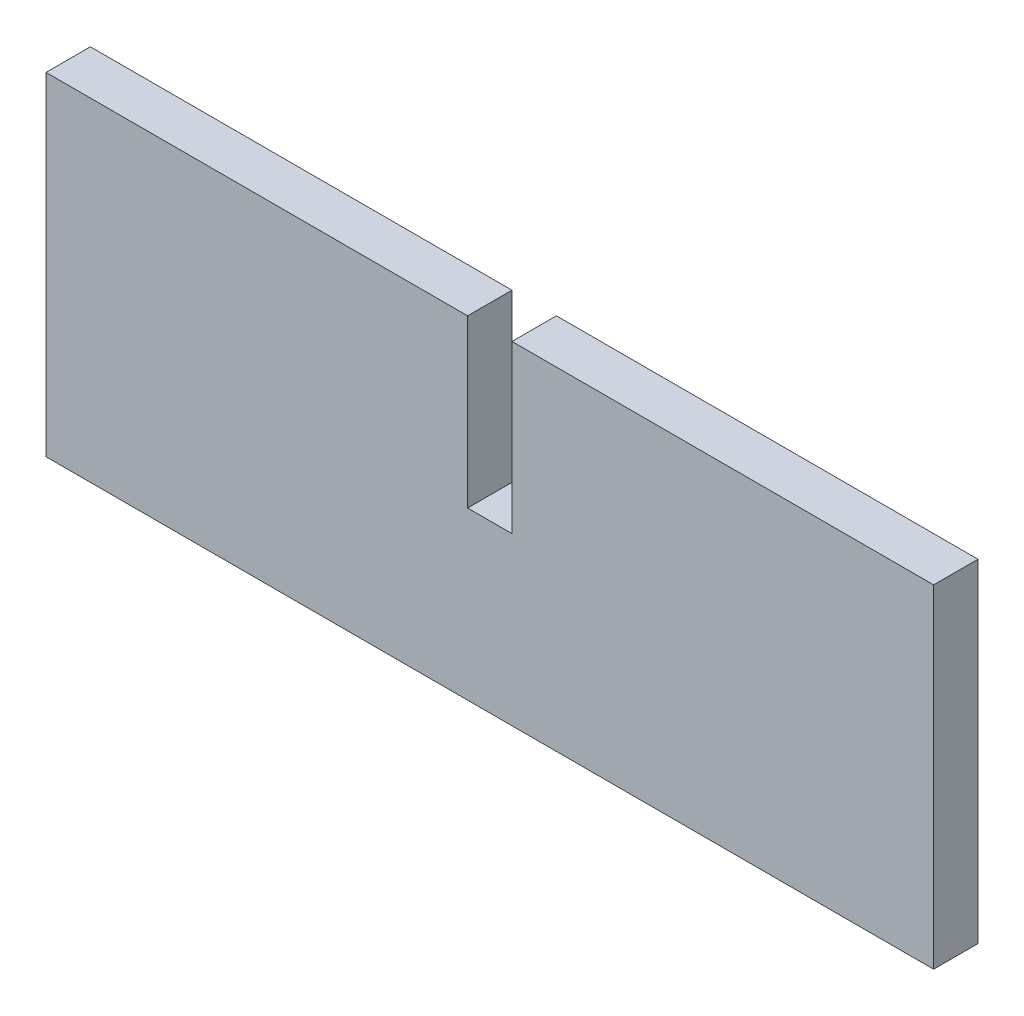
ISO-10303-21;
HEADER;
FILE_DESCRIPTION(('STEP AP214'),'2;1');
FILE_NAME('part.step','',(''),(''),'','','');
FILE_SCHEMA(('AUTOMOTIVE_DESIGN { 1 0 10303 214 1 1 1 1 }'));
ENDSEC;
DATA;
#1=APPLICATION_CONTEXT('core data for automotive mechanical design processes');
#2=APPLICATION_PROTOCOL_DEFINITION('international standard','automotive_design',2000,#1);
#3=PRODUCT_CONTEXT('',#1,'mechanical');
#4=PRODUCT('Part','Part','',(#3));
#5=PRODUCT_RELATED_PRODUCT_CATEGORY('part','',(#4));
#6=PRODUCT_DEFINITION_FORMATION('','',#4);
#7=PRODUCT_DEFINITION_CONTEXT('part definition',#1,'design');
#8=PRODUCT_DEFINITION('design','',#6,#7);
#9=PRODUCT_DEFINITION_SHAPE('','',#8);
#10=(LENGTH_UNIT() NAMED_UNIT(*) SI_UNIT(.MILLI.,.METRE.));
#11=(NAMED_UNIT(*) PLANE_ANGLE_UNIT() SI_UNIT($,.RADIAN.));
#12=(NAMED_UNIT(*) SI_UNIT($,.STERADIAN.) SOLID_ANGLE_UNIT());
#13=UNCERTAINTY_MEASURE_WITH_UNIT(LENGTH_MEASURE(1.E-05),#10,'distance_accuracy_value','');
#14=(GEOMETRIC_REPRESENTATION_CONTEXT(3) GLOBAL_UNCERTAINTY_ASSIGNED_CONTEXT((#13)) GLOBAL_UNIT_ASSIGNED_CONTEXT((#10,
#11,#12)) REPRESENTATION_CONTEXT('',''));
#15=CARTESIAN_POINT('',(0.,0.,0.));
#16=DIRECTION('',(0.,0.,1.));
#17=DIRECTION('',(1.,0.,0.));
#18=AXIS2_PLACEMENT_3D('',#15,#16,#17);
#19=CARTESIAN_POINT('',(-4.,60.,8.));
#20=DIRECTION('',(-1.,0.,0.));
#21=DIRECTION('',(0.,-1.,0.));
#22=AXIS2_PLACEMENT_3D('',#19,#20,#21);
#23=PLANE('',#22);
#24=DIRECTION('',(0.,1.,0.));
#25=VECTOR('',#24,1.);
#26=CARTESIAN_POINT('',(-4.,60.,0.));
#27=LINE('',#26,#25);
#28=CARTESIAN_POINT('',(-4.,30.,0.));
#29=VERTEX_POINT('',#28);
#30=CARTESIAN_POINT('',(-4.,60.,0.));
#31=VERTEX_POINT('',#30);
#32=EDGE_CURVE('E128',#29,#31,#27,.T.);
#33=ORIENTED_EDGE('',*,*,#32,.T.);
#34=DIRECTION('',(0.,0.,-1.));
#35=VECTOR('',#34,1.);
#36=CARTESIAN_POINT('',(-4.,60.,8.));
#37=LINE('',#36,#35);
#38=CARTESIAN_POINT('',(-4.,60.,8.));
#39=VERTEX_POINT('',#38);
#40=EDGE_CURVE('E11',#39,#31,#37,.T.);
#41=ORIENTED_EDGE('',*,*,#40,.F.);
#42=DIRECTION('',(0.,1.,0.));
#43=VECTOR('',#42,1.);
#44=CARTESIAN_POINT('',(-4.,60.,8.));
#45=LINE('',#44,#43);
#46=CARTESIAN_POINT('',(-4.,30.,8.));
#47=VERTEX_POINT('',#46);
#48=EDGE_CURVE('E142',#47,#39,#45,.T.);
#49=ORIENTED_EDGE('',*,*,#48,.F.);
#50=DIRECTION('',(0.,0.,-1.));
#51=VECTOR('',#50,1.);
#52=CARTESIAN_POINT('',(-4.,30.,8.));
#53=LINE('',#52,#51);
#54=EDGE_CURVE('E124',#47,#29,#53,.T.);
#55=ORIENTED_EDGE('',*,*,#54,.T.);
#56=EDGE_LOOP('',(#33,#41,#49,#55));
#57=FACE_BOUND('',#56,.T.);
#58=ADVANCED_FACE('F32',(#57),#23,.F.);
#59=CARTESIAN_POINT('',(-4.,60.,8.));
#60=DIRECTION('',(0.,-1.,0.));
#61=DIRECTION('',(1.,0.,0.));
#62=AXIS2_PLACEMENT_3D('',#59,#60,#61);
#63=PLANE('',#62);
#64=DIRECTION('',(-1.,0.,0.));
#65=VECTOR('',#64,1.);
#66=CARTESIAN_POINT('',(-4.,60.,0.));
#67=LINE('',#66,#65);
#68=CARTESIAN_POINT('',(-80.,60.,0.));
#69=VERTEX_POINT('',#68);
#70=EDGE_CURVE('E131',#31,#69,#67,.T.);
#71=ORIENTED_EDGE('',*,*,#70,.T.);
#72=DIRECTION('',(0.,0.,-1.));
#73=VECTOR('',#72,1.);
#74=CARTESIAN_POINT('',(-80.,60.,8.));
#75=LINE('',#74,#73);
#76=CARTESIAN_POINT('',(-80.,60.,8.));
#77=VERTEX_POINT('',#76);
#78=EDGE_CURVE('E40',#77,#69,#75,.T.);
#79=ORIENTED_EDGE('',*,*,#78,.F.);
#80=DIRECTION('',(-1.,0.,0.));
#81=VECTOR('',#80,1.);
#82=CARTESIAN_POINT('',(-4.,60.,8.));
#83=LINE('',#82,#81);
#84=EDGE_CURVE('E91',#39,#77,#83,.T.);
#85=ORIENTED_EDGE('',*,*,#84,.F.);
#86=ORIENTED_EDGE('',*,*,#40,.T.);
#87=EDGE_LOOP('',(#71,#79,#85,#86));
#88=FACE_BOUND('',#87,.T.);
#89=ADVANCED_FACE('F177',(#88),#63,.F.);
#90=CARTESIAN_POINT('',(-80.,60.,8.));
#91=DIRECTION('',(1.,0.,0.));
#92=DIRECTION('',(0.,1.,0.));
#93=AXIS2_PLACEMENT_3D('',#90,#91,#92);
#94=PLANE('',#93);
#95=DIRECTION('',(0.,-1.,0.));
#96=VECTOR('',#95,1.);
#97=CARTESIAN_POINT('',(-80.,60.,0.));
#98=LINE('',#97,#96);
#99=CARTESIAN_POINT('',(-80.,0.,0.));
#100=VERTEX_POINT('',#99);
#101=EDGE_CURVE('E133',#69,#100,#98,.T.);
#102=ORIENTED_EDGE('',*,*,#101,.T.);
#103=DIRECTION('',(0.,0.,-1.));
#104=VECTOR('',#103,1.);
#105=CARTESIAN_POINT('',(-80.,0.,8.));
#106=LINE('',#105,#104);
#107=CARTESIAN_POINT('',(-80.,0.,8.));
#108=VERTEX_POINT('',#107);
#109=EDGE_CURVE('E149',#108,#100,#106,.T.);
#110=ORIENTED_EDGE('',*,*,#109,.F.);
#111=DIRECTION('',(0.,-1.,0.));
#112=VECTOR('',#111,1.);
#113=CARTESIAN_POINT('',(-80.,60.,8.));
#114=LINE('',#113,#112);
#115=EDGE_CURVE('E157',#77,#108,#114,.T.);
#116=ORIENTED_EDGE('',*,*,#115,.F.);
#117=ORIENTED_EDGE('',*,*,#78,.T.);
#118=EDGE_LOOP('',(#102,#110,#116,#117));
#119=FACE_BOUND('',#118,.T.);
#120=ADVANCED_FACE('F155',(#119),#94,.F.);
#121=CARTESIAN_POINT('',(-80.,0.,8.));
#122=DIRECTION('',(0.,1.,0.));
#123=DIRECTION('',(0.,0.,1.));
#124=AXIS2_PLACEMENT_3D('',#121,#122,#123);
#125=PLANE('',#124);
#126=DIRECTION('',(1.,0.,0.));
#127=VECTOR('',#126,1.);
#128=CARTESIAN_POINT('',(-80.,0.,0.));
#129=LINE('',#128,#127);
#130=CARTESIAN_POINT('',(80.,0.,0.));
#131=VERTEX_POINT('',#130);
#132=EDGE_CURVE('E135',#100,#131,#129,.T.);
#133=ORIENTED_EDGE('',*,*,#132,.T.);
#134=DIRECTION('',(0.,0.,-1.));
#135=VECTOR('',#134,1.);
#136=CARTESIAN_POINT('',(80.,0.,8.));
#137=LINE('',#136,#135);
#138=CARTESIAN_POINT('',(80.,0.,8.));
#139=VERTEX_POINT('',#138);
#140=EDGE_CURVE('E146',#139,#131,#137,.T.);
#141=ORIENTED_EDGE('',*,*,#140,.F.);
#142=DIRECTION('',(1.,0.,0.));
#143=VECTOR('',#142,1.);
#144=CARTESIAN_POINT('',(-80.,0.,8.));
#145=LINE('',#144,#143);
#146=EDGE_CURVE('E169',#108,#139,#145,.T.);
#147=ORIENTED_EDGE('',*,*,#146,.F.);
#148=ORIENTED_EDGE('',*,*,#109,.T.);
#149=EDGE_LOOP('',(#133,#141,#147,#148));
#150=FACE_BOUND('',#149,.T.);
#151=ADVANCED_FACE('F165',(#150),#125,.F.);
#152=CARTESIAN_POINT('',(80.,60.,8.));
#153=DIRECTION('',(-1.,0.,0.));
#154=DIRECTION('',(0.,-1.,0.));
#155=AXIS2_PLACEMENT_3D('',#152,#153,#154);
#156=PLANE('',#155);
#157=DIRECTION('',(0.,1.,0.));
#158=VECTOR('',#157,1.);
#159=CARTESIAN_POINT('',(80.,60.,0.));
#160=LINE('',#159,#158);
#161=CARTESIAN_POINT('',(80.,60.,0.));
#162=VERTEX_POINT('',#161);
#163=EDGE_CURVE('E137',#131,#162,#160,.T.);
#164=ORIENTED_EDGE('',*,*,#163,.T.);
#165=DIRECTION('',(0.,0.,-1.));
#166=VECTOR('',#165,1.);
#167=CARTESIAN_POINT('',(80.,60.,8.));
#168=LINE('',#167,#166);
#169=CARTESIAN_POINT('',(80.,60.,8.));
#170=VERTEX_POINT('',#169);
#171=EDGE_CURVE('E119',#170,#162,#168,.T.);
#172=ORIENTED_EDGE('',*,*,#171,.F.);
#173=DIRECTION('',(0.,1.,0.));
#174=VECTOR('',#173,1.);
#175=CARTESIAN_POINT('',(80.,60.,8.));
#176=LINE('',#175,#174);
#177=EDGE_CURVE('E110',#139,#170,#176,.T.);
#178=ORIENTED_EDGE('',*,*,#177,.F.);
#179=ORIENTED_EDGE('',*,*,#140,.T.);
#180=EDGE_LOOP('',(#164,#172,#178,#179));
#181=FACE_BOUND('',#180,.T.);
#182=ADVANCED_FACE('F168',(#181),#156,.F.);
#183=CARTESIAN_POINT('',(4.,60.,8.));
#184=DIRECTION('',(0.,-1.,0.));
#185=DIRECTION('',(1.,0.,0.));
#186=AXIS2_PLACEMENT_3D('',#183,#184,#185);
#187=PLANE('',#186);
#188=DIRECTION('',(-1.,0.,0.));
#189=VECTOR('',#188,1.);
#190=CARTESIAN_POINT('',(4.,60.,0.));
#191=LINE('',#190,#189);
#192=CARTESIAN_POINT('',(4.,60.,0.));
#193=VERTEX_POINT('',#192);
#194=EDGE_CURVE('E118',#162,#193,#191,.T.);
#195=ORIENTED_EDGE('',*,*,#194,.T.);
#196=DIRECTION('',(0.,0.,-1.));
#197=VECTOR('',#196,1.);
#198=CARTESIAN_POINT('',(4.,60.,8.));
#199=LINE('',#198,#197);
#200=CARTESIAN_POINT('',(4.,60.,8.));
#201=VERTEX_POINT('',#200);
#202=EDGE_CURVE('E115',#201,#193,#199,.T.);
#203=ORIENTED_EDGE('',*,*,#202,.F.);
#204=DIRECTION('',(-1.,0.,0.));
#205=VECTOR('',#204,1.);
#206=CARTESIAN_POINT('',(4.,60.,8.));
#207=LINE('',#206,#205);
#208=EDGE_CURVE('E104',#170,#201,#207,.T.);
#209=ORIENTED_EDGE('',*,*,#208,.F.);
#210=ORIENTED_EDGE('',*,*,#171,.T.);
#211=EDGE_LOOP('',(#195,#203,#209,#210));
#212=FACE_BOUND('',#211,.T.);
#213=ADVANCED_FACE('F116',(#212),#187,.F.);
#214=CARTESIAN_POINT('',(4.,60.,8.));
#215=DIRECTION('',(1.,0.,0.));
#216=DIRECTION('',(0.,1.,0.));
#217=AXIS2_PLACEMENT_3D('',#214,#215,#216);
#218=PLANE('',#217);
#219=DIRECTION('',(0.,-1.,0.));
#220=VECTOR('',#219,1.);
#221=CARTESIAN_POINT('',(4.,60.,0.));
#222=LINE('',#221,#220);
#223=CARTESIAN_POINT('',(4.,30.,0.));
#224=VERTEX_POINT('',#223);
#225=EDGE_CURVE('E77',#193,#224,#222,.T.);
#226=ORIENTED_EDGE('',*,*,#225,.T.);
#227=DIRECTION('',(0.,0.,-1.));
#228=VECTOR('',#227,1.);
#229=CARTESIAN_POINT('',(4.,30.,8.));
#230=LINE('',#229,#228);
#231=CARTESIAN_POINT('',(4.,30.,8.));
#232=VERTEX_POINT('',#231);
#233=EDGE_CURVE('E120',#232,#224,#230,.T.);
#234=ORIENTED_EDGE('',*,*,#233,.F.);
#235=DIRECTION('',(0.,-1.,0.));
#236=VECTOR('',#235,1.);
#237=CARTESIAN_POINT('',(4.,60.,8.));
#238=LINE('',#237,#236);
#239=EDGE_CURVE('E108',#201,#232,#238,.T.);
#240=ORIENTED_EDGE('',*,*,#239,.F.);
#241=ORIENTED_EDGE('',*,*,#202,.T.);
#242=EDGE_LOOP('',(#226,#234,#240,#241));
#243=FACE_BOUND('',#242,.T.);
#244=ADVANCED_FACE('F122',(#243),#218,.F.);
#245=CARTESIAN_POINT('',(-4.,30.,8.));
#246=DIRECTION('',(0.,-1.,0.));
#247=DIRECTION('',(1.,0.,0.));
#248=AXIS2_PLACEMENT_3D('',#245,#246,#247);
#249=PLANE('',#248);
#250=DIRECTION('',(-1.,0.,0.));
#251=VECTOR('',#250,1.);
#252=CARTESIAN_POINT('',(-4.,30.,0.));
#253=LINE('',#252,#251);
#254=EDGE_CURVE('E83',#224,#29,#253,.T.);
#255=ORIENTED_EDGE('',*,*,#254,.T.);
#256=ORIENTED_EDGE('',*,*,#54,.F.);
#257=DIRECTION('',(-1.,0.,0.));
#258=VECTOR('',#257,1.);
#259=CARTESIAN_POINT('',(-4.,30.,8.));
#260=LINE('',#259,#258);
#261=EDGE_CURVE('E48',#232,#47,#260,.T.);
#262=ORIENTED_EDGE('',*,*,#261,.F.);
#263=ORIENTED_EDGE('',*,*,#233,.T.);
#264=EDGE_LOOP('',(#255,#256,#262,#263));
#265=FACE_BOUND('',#264,.T.);
#266=ADVANCED_FACE('F193',(#265),#249,.F.);
#267=CARTESIAN_POINT('',(0.,0.,8.));
#268=DIRECTION('',(0.,0.,1.));
#269=DIRECTION('',(1.,0.,0.));
#270=AXIS2_PLACEMENT_3D('',#267,#268,#269);
#271=PLANE('',#270);
#272=ORIENTED_EDGE('',*,*,#48,.T.);
#273=ORIENTED_EDGE('',*,*,#84,.T.);
#274=ORIENTED_EDGE('',*,*,#115,.T.);
#275=ORIENTED_EDGE('',*,*,#146,.T.);
#276=ORIENTED_EDGE('',*,*,#177,.T.);
#277=ORIENTED_EDGE('',*,*,#208,.T.);
#278=ORIENTED_EDGE('',*,*,#239,.T.);
#279=ORIENTED_EDGE('',*,*,#261,.T.);
#280=EDGE_LOOP('',(#272,#273,#274,#275,#276,#277,#278,#279));
#281=FACE_BOUND('',#280,.T.);
#282=ADVANCED_FACE('F106',(#281),#271,.T.);
#283=CARTESIAN_POINT('',(0.,0.,0.));
#284=DIRECTION('',(0.,0.,1.));
#285=DIRECTION('',(1.,0.,0.));
#286=AXIS2_PLACEMENT_3D('',#283,#284,#285);
#287=PLANE('',#286);
#288=ORIENTED_EDGE('',*,*,#32,.F.);
#289=ORIENTED_EDGE('',*,*,#254,.F.);
#290=ORIENTED_EDGE('',*,*,#225,.F.);
#291=ORIENTED_EDGE('',*,*,#194,.F.);
#292=ORIENTED_EDGE('',*,*,#163,.F.);
#293=ORIENTED_EDGE('',*,*,#132,.F.);
#294=ORIENTED_EDGE('',*,*,#101,.F.);
#295=ORIENTED_EDGE('',*,*,#70,.F.);
#296=EDGE_LOOP('',(#288,#289,#290,#291,#292,#293,#294,#295));
#297=FACE_BOUND('',#296,.T.);
#298=ADVANCED_FACE('F161',(#297),#287,.F.);
#299=CLOSED_SHELL('',(#58,#89,#120,#151,#182,#213,#244,#266,#282,#298));
#300=MANIFOLD_SOLID_BREP('B2',#299);
#301=ADVANCED_BREP_SHAPE_REPRESENTATION('',(#18,#300),#14);
#302=SHAPE_DEFINITION_REPRESENTATION(#9,#301);
ENDSEC;
END-ISO-10303-21;
